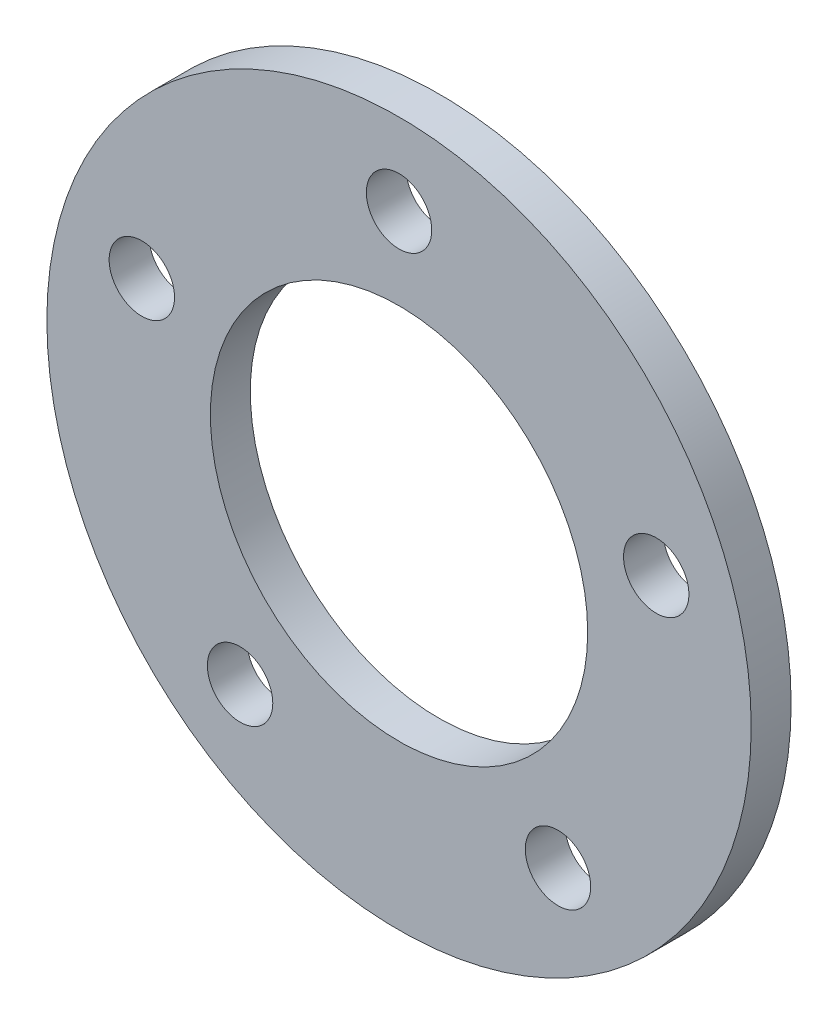
ISO-10303-21;
HEADER;
FILE_DESCRIPTION(('STEP AP214'),'2;1');
FILE_NAME('part.step','',(''),(''),'','','');
FILE_SCHEMA(('AUTOMOTIVE_DESIGN { 1 0 10303 214 1 1 1 1 }'));
ENDSEC;
DATA;
#1=APPLICATION_CONTEXT('core data for automotive mechanical design processes');
#2=APPLICATION_PROTOCOL_DEFINITION('international standard','automotive_design',2000,#1);
#3=PRODUCT_CONTEXT('',#1,'mechanical');
#4=PRODUCT('Part','Part','',(#3));
#5=PRODUCT_RELATED_PRODUCT_CATEGORY('part','',(#4));
#6=PRODUCT_DEFINITION_FORMATION('','',#4);
#7=PRODUCT_DEFINITION_CONTEXT('part definition',#1,'design');
#8=PRODUCT_DEFINITION('design','',#6,#7);
#9=PRODUCT_DEFINITION_SHAPE('','',#8);
#10=(LENGTH_UNIT() NAMED_UNIT(*) SI_UNIT(.MILLI.,.METRE.));
#11=(NAMED_UNIT(*) PLANE_ANGLE_UNIT() SI_UNIT($,.RADIAN.));
#12=(NAMED_UNIT(*) SI_UNIT($,.STERADIAN.) SOLID_ANGLE_UNIT());
#13=UNCERTAINTY_MEASURE_WITH_UNIT(LENGTH_MEASURE(1.E-05),#10,'distance_accuracy_value','');
#14=(GEOMETRIC_REPRESENTATION_CONTEXT(3) GLOBAL_UNCERTAINTY_ASSIGNED_CONTEXT((#13)) GLOBAL_UNIT_ASSIGNED_CONTEXT((#10,
#11,#12)) REPRESENTATION_CONTEXT('',''));
#15=CARTESIAN_POINT('',(0.,0.,0.));
#16=DIRECTION('',(0.,0.,1.));
#17=DIRECTION('',(1.,0.,0.));
#18=AXIS2_PLACEMENT_3D('',#15,#16,#17);
#19=CARTESIAN_POINT('',(0.,0.,3.175));
#20=DIRECTION('',(0.,0.,1.));
#21=DIRECTION('',(1.,0.,0.));
#22=AXIS2_PLACEMENT_3D('',#19,#20,#21);
#23=PLANE('',#22);
#24=CARTESIAN_POINT('',(-12.6373829242883,-17.3938653790613,3.175));
#25=DIRECTION('',(0.,0.,1.));
#26=DIRECTION('',(1.,0.,0.));
#27=AXIS2_PLACEMENT_3D('',#24,#25,#26);
#28=CIRCLE('',#27,2.6);
#29=CARTESIAN_POINT('',(-10.0373829242883,-17.3938653790613,3.175));
#30=VERTEX_POINT('',#29);
#31=EDGE_CURVE('E88',#30,#30,#28,.T.);
#32=ORIENTED_EDGE('',*,*,#31,.F.);
#33=EDGE_LOOP('',(#32));
#34=FACE_BOUND('',#33,.T.);
#35=CARTESIAN_POINT('',(20.4477151003458,6.64386537906131,3.175));
#36=DIRECTION('',(0.,0.,1.));
#37=DIRECTION('',(1.,0.,0.));
#38=AXIS2_PLACEMENT_3D('',#35,#36,#37);
#39=CIRCLE('',#38,2.6);
#40=CARTESIAN_POINT('',(23.0477151003458,6.64386537906131,3.175));
#41=VERTEX_POINT('',#40);
#42=EDGE_CURVE('E72',#41,#41,#39,.T.);
#43=ORIENTED_EDGE('',*,*,#42,.F.);
#44=EDGE_LOOP('',(#43));
#45=FACE_BOUND('',#44,.T.);
#46=CARTESIAN_POINT('',(0.,0.,3.175));
#47=DIRECTION('',(0.,0.,1.));
#48=DIRECTION('',(1.,0.,0.));
#49=AXIS2_PLACEMENT_3D('',#46,#47,#48);
#50=CIRCLE('',#49,15.);
#51=CARTESIAN_POINT('',(15.,0.,3.175));
#52=VERTEX_POINT('',#51);
#53=EDGE_CURVE('E58',#52,#52,#50,.T.);
#54=ORIENTED_EDGE('',*,*,#53,.F.);
#55=EDGE_LOOP('',(#54));
#56=FACE_BOUND('',#55,.T.);
#57=CARTESIAN_POINT('',(0.,0.,3.175));
#58=DIRECTION('',(0.,0.,1.));
#59=DIRECTION('',(1.,0.,0.));
#60=AXIS2_PLACEMENT_3D('',#57,#58,#59);
#61=CIRCLE('',#60,28.);
#62=CARTESIAN_POINT('',(28.,0.,3.175));
#63=VERTEX_POINT('',#62);
#64=EDGE_CURVE('E10',#63,#63,#61,.T.);
#65=ORIENTED_EDGE('',*,*,#64,.T.);
#66=EDGE_LOOP('',(#65));
#67=FACE_BOUND('',#66,.T.);
#68=CARTESIAN_POINT('',(0.,21.5,3.175));
#69=DIRECTION('',(0.,0.,1.));
#70=DIRECTION('',(1.,0.,0.));
#71=AXIS2_PLACEMENT_3D('',#68,#69,#70);
#72=CIRCLE('',#71,2.6);
#73=CARTESIAN_POINT('',(2.6,21.5,3.175));
#74=VERTEX_POINT('',#73);
#75=EDGE_CURVE('E64',#74,#74,#72,.T.);
#76=ORIENTED_EDGE('',*,*,#75,.F.);
#77=EDGE_LOOP('',(#76));
#78=FACE_BOUND('',#77,.T.);
#79=CARTESIAN_POINT('',(12.6373829242881,-17.3938653790614,3.175));
#80=DIRECTION('',(0.,0.,1.));
#81=DIRECTION('',(1.,0.,0.));
#82=AXIS2_PLACEMENT_3D('',#79,#80,#81);
#83=CIRCLE('',#82,2.6);
#84=CARTESIAN_POINT('',(15.2373829242881,-17.3938653790614,3.175));
#85=VERTEX_POINT('',#84);
#86=EDGE_CURVE('E80',#85,#85,#83,.T.);
#87=ORIENTED_EDGE('',*,*,#86,.F.);
#88=EDGE_LOOP('',(#87));
#89=FACE_BOUND('',#88,.T.);
#90=CARTESIAN_POINT('',(-20.4477151003457,6.6438653790616,3.175));
#91=DIRECTION('',(0.,0.,1.));
#92=DIRECTION('',(1.,0.,0.));
#93=AXIS2_PLACEMENT_3D('',#90,#91,#92);
#94=CIRCLE('',#93,2.6);
#95=CARTESIAN_POINT('',(-17.8477151003457,6.6438653790616,3.175));
#96=VERTEX_POINT('',#95);
#97=EDGE_CURVE('E96',#96,#96,#94,.T.);
#98=ORIENTED_EDGE('',*,*,#97,.F.);
#99=EDGE_LOOP('',(#98));
#100=FACE_BOUND('',#99,.T.);
#101=ADVANCED_FACE('F45',(#34,#45,#56,#67,#78,#89,#100),#23,.T.);
#102=CARTESIAN_POINT('',(0.,0.,0.));
#103=DIRECTION('',(0.,0.,1.));
#104=DIRECTION('',(1.,0.,0.));
#105=AXIS2_PLACEMENT_3D('',#102,#103,#104);
#106=PLANE('',#105);
#107=CARTESIAN_POINT('',(0.,0.,0.));
#108=DIRECTION('',(0.,0.,1.));
#109=DIRECTION('',(1.,0.,0.));
#110=AXIS2_PLACEMENT_3D('',#107,#108,#109);
#111=CIRCLE('',#110,28.);
#112=CARTESIAN_POINT('',(28.,0.,0.));
#113=VERTEX_POINT('',#112);
#114=EDGE_CURVE('E49',#113,#113,#111,.T.);
#115=ORIENTED_EDGE('',*,*,#114,.F.);
#116=EDGE_LOOP('',(#115));
#117=FACE_BOUND('',#116,.T.);
#118=CARTESIAN_POINT('',(0.,0.,0.));
#119=DIRECTION('',(0.,0.,1.));
#120=DIRECTION('',(1.,0.,0.));
#121=AXIS2_PLACEMENT_3D('',#118,#119,#120);
#122=CIRCLE('',#121,15.);
#123=CARTESIAN_POINT('',(15.,0.,0.));
#124=VERTEX_POINT('',#123);
#125=EDGE_CURVE('E60',#124,#124,#122,.T.);
#126=ORIENTED_EDGE('',*,*,#125,.T.);
#127=EDGE_LOOP('',(#126));
#128=FACE_BOUND('',#127,.T.);
#129=CARTESIAN_POINT('',(0.,21.5,0.));
#130=DIRECTION('',(0.,0.,1.));
#131=DIRECTION('',(1.,0.,0.));
#132=AXIS2_PLACEMENT_3D('',#129,#130,#131);
#133=CIRCLE('',#132,2.6);
#134=CARTESIAN_POINT('',(2.6,21.5,0.));
#135=VERTEX_POINT('',#134);
#136=EDGE_CURVE('E68',#135,#135,#133,.T.);
#137=ORIENTED_EDGE('',*,*,#136,.T.);
#138=EDGE_LOOP('',(#137));
#139=FACE_BOUND('',#138,.T.);
#140=CARTESIAN_POINT('',(20.4477151003458,6.64386537906131,0.));
#141=DIRECTION('',(0.,0.,1.));
#142=DIRECTION('',(1.,0.,0.));
#143=AXIS2_PLACEMENT_3D('',#140,#141,#142);
#144=CIRCLE('',#143,2.6);
#145=CARTESIAN_POINT('',(23.0477151003458,6.64386537906131,0.));
#146=VERTEX_POINT('',#145);
#147=EDGE_CURVE('E76',#146,#146,#144,.T.);
#148=ORIENTED_EDGE('',*,*,#147,.T.);
#149=EDGE_LOOP('',(#148));
#150=FACE_BOUND('',#149,.T.);
#151=CARTESIAN_POINT('',(12.6373829242881,-17.3938653790614,0.));
#152=DIRECTION('',(0.,0.,1.));
#153=DIRECTION('',(1.,0.,0.));
#154=AXIS2_PLACEMENT_3D('',#151,#152,#153);
#155=CIRCLE('',#154,2.6);
#156=CARTESIAN_POINT('',(15.2373829242881,-17.3938653790614,0.));
#157=VERTEX_POINT('',#156);
#158=EDGE_CURVE('E84',#157,#157,#155,.T.);
#159=ORIENTED_EDGE('',*,*,#158,.T.);
#160=EDGE_LOOP('',(#159));
#161=FACE_BOUND('',#160,.T.);
#162=CARTESIAN_POINT('',(-12.6373829242883,-17.3938653790613,0.));
#163=DIRECTION('',(0.,0.,1.));
#164=DIRECTION('',(1.,0.,0.));
#165=AXIS2_PLACEMENT_3D('',#162,#163,#164);
#166=CIRCLE('',#165,2.6);
#167=CARTESIAN_POINT('',(-10.0373829242883,-17.3938653790613,0.));
#168=VERTEX_POINT('',#167);
#169=EDGE_CURVE('E92',#168,#168,#166,.T.);
#170=ORIENTED_EDGE('',*,*,#169,.T.);
#171=EDGE_LOOP('',(#170));
#172=FACE_BOUND('',#171,.T.);
#173=CARTESIAN_POINT('',(-20.4477151003457,6.6438653790616,0.));
#174=DIRECTION('',(0.,0.,1.));
#175=DIRECTION('',(1.,0.,0.));
#176=AXIS2_PLACEMENT_3D('',#173,#174,#175);
#177=CIRCLE('',#176,2.6);
#178=CARTESIAN_POINT('',(-17.8477151003457,6.6438653790616,0.));
#179=VERTEX_POINT('',#178);
#180=EDGE_CURVE('E100',#179,#179,#177,.T.);
#181=ORIENTED_EDGE('',*,*,#180,.T.);
#182=EDGE_LOOP('',(#181));
#183=FACE_BOUND('',#182,.T.);
#184=ADVANCED_FACE('F112',(#117,#128,#139,#150,#161,#172,#183),#106,.F.);
#185=CARTESIAN_POINT('',(0.,0.,3.175));
#186=DIRECTION('',(0.,0.,-1.));
#187=DIRECTION('',(-1.,0.,0.));
#188=AXIS2_PLACEMENT_3D('',#185,#186,#187);
#189=CYLINDRICAL_SURFACE('',#188,28.);
#190=ORIENTED_EDGE('',*,*,#64,.F.);
#191=EDGE_LOOP('',(#190));
#192=FACE_BOUND('',#191,.T.);
#193=ORIENTED_EDGE('',*,*,#114,.T.);
#194=EDGE_LOOP('',(#193));
#195=FACE_BOUND('',#194,.T.);
#196=ADVANCED_FACE('F47',(#192,#195),#189,.T.);
#197=CARTESIAN_POINT('',(0.,0.,3.175));
#198=DIRECTION('',(0.,0.,-1.));
#199=DIRECTION('',(-1.,0.,0.));
#200=AXIS2_PLACEMENT_3D('',#197,#198,#199);
#201=CYLINDRICAL_SURFACE('',#200,15.);
#202=ORIENTED_EDGE('',*,*,#53,.T.);
#203=EDGE_LOOP('',(#202));
#204=FACE_BOUND('',#203,.T.);
#205=ORIENTED_EDGE('',*,*,#125,.F.);
#206=EDGE_LOOP('',(#205));
#207=FACE_BOUND('',#206,.T.);
#208=ADVANCED_FACE('F122',(#204,#207),#201,.F.);
#209=CARTESIAN_POINT('',(0.,21.5,3.175));
#210=DIRECTION('',(0.,0.,-1.));
#211=DIRECTION('',(-1.,0.,0.));
#212=AXIS2_PLACEMENT_3D('',#209,#210,#211);
#213=CYLINDRICAL_SURFACE('',#212,2.6);
#214=ORIENTED_EDGE('',*,*,#75,.T.);
#215=EDGE_LOOP('',(#214));
#216=FACE_BOUND('',#215,.T.);
#217=ORIENTED_EDGE('',*,*,#136,.F.);
#218=EDGE_LOOP('',(#217));
#219=FACE_BOUND('',#218,.T.);
#220=ADVANCED_FACE('F125',(#216,#219),#213,.F.);
#221=CARTESIAN_POINT('',(20.4477151003458,6.64386537906131,3.175));
#222=DIRECTION('',(0.,0.,-1.));
#223=DIRECTION('',(-1.,0.,0.));
#224=AXIS2_PLACEMENT_3D('',#221,#222,#223);
#225=CYLINDRICAL_SURFACE('',#224,2.6);
#226=ORIENTED_EDGE('',*,*,#42,.T.);
#227=EDGE_LOOP('',(#226));
#228=FACE_BOUND('',#227,.T.);
#229=ORIENTED_EDGE('',*,*,#147,.F.);
#230=EDGE_LOOP('',(#229));
#231=FACE_BOUND('',#230,.T.);
#232=ADVANCED_FACE('F129',(#228,#231),#225,.F.);
#233=CARTESIAN_POINT('',(12.6373829242881,-17.3938653790614,3.175));
#234=DIRECTION('',(0.,0.,-1.));
#235=DIRECTION('',(-1.,0.,0.));
#236=AXIS2_PLACEMENT_3D('',#233,#234,#235);
#237=CYLINDRICAL_SURFACE('',#236,2.6);
#238=ORIENTED_EDGE('',*,*,#86,.T.);
#239=EDGE_LOOP('',(#238));
#240=FACE_BOUND('',#239,.T.);
#241=ORIENTED_EDGE('',*,*,#158,.F.);
#242=EDGE_LOOP('',(#241));
#243=FACE_BOUND('',#242,.T.);
#244=ADVANCED_FACE('F133',(#240,#243),#237,.F.);
#245=CARTESIAN_POINT('',(-12.6373829242883,-17.3938653790613,3.175));
#246=DIRECTION('',(0.,0.,-1.));
#247=DIRECTION('',(-1.,0.,0.));
#248=AXIS2_PLACEMENT_3D('',#245,#246,#247);
#249=CYLINDRICAL_SURFACE('',#248,2.6);
#250=ORIENTED_EDGE('',*,*,#31,.T.);
#251=EDGE_LOOP('',(#250));
#252=FACE_BOUND('',#251,.T.);
#253=ORIENTED_EDGE('',*,*,#169,.F.);
#254=EDGE_LOOP('',(#253));
#255=FACE_BOUND('',#254,.T.);
#256=ADVANCED_FACE('F137',(#252,#255),#249,.F.);
#257=CARTESIAN_POINT('',(-20.4477151003457,6.6438653790616,3.175));
#258=DIRECTION('',(0.,0.,-1.));
#259=DIRECTION('',(-1.,0.,0.));
#260=AXIS2_PLACEMENT_3D('',#257,#258,#259);
#261=CYLINDRICAL_SURFACE('',#260,2.6);
#262=ORIENTED_EDGE('',*,*,#97,.T.);
#263=EDGE_LOOP('',(#262));
#264=FACE_BOUND('',#263,.T.);
#265=ORIENTED_EDGE('',*,*,#180,.F.);
#266=EDGE_LOOP('',(#265));
#267=FACE_BOUND('',#266,.T.);
#268=ADVANCED_FACE('F108',(#264,#267),#261,.F.);
#269=CLOSED_SHELL('',(#101,#184,#196,#208,#220,#232,#244,#256,#268));
#270=MANIFOLD_SOLID_BREP('B2',#269);
#271=ADVANCED_BREP_SHAPE_REPRESENTATION('',(#18,#270),#14);
#272=SHAPE_DEFINITION_REPRESENTATION(#9,#271);
ENDSEC;
END-ISO-10303-21;
